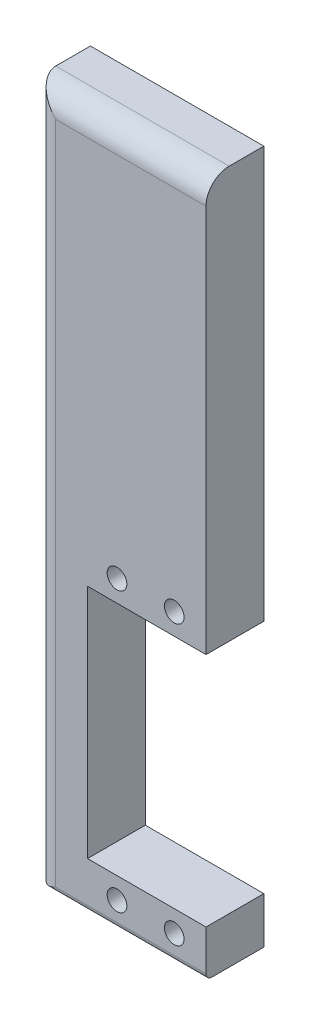
ISO-10303-21;
HEADER;
FILE_DESCRIPTION(('STEP AP214'),'2;1');
FILE_NAME('part.step','',(''),(''),'','','');
FILE_SCHEMA(('AUTOMOTIVE_DESIGN { 1 0 10303 214 1 1 1 1 }'));
ENDSEC;
DATA;
#1=APPLICATION_CONTEXT('core data for automotive mechanical design processes');
#2=APPLICATION_PROTOCOL_DEFINITION('international standard','automotive_design',2000,#1);
#3=PRODUCT_CONTEXT('',#1,'mechanical');
#4=PRODUCT('Part','Part','',(#3));
#5=PRODUCT_RELATED_PRODUCT_CATEGORY('part','',(#4));
#6=PRODUCT_DEFINITION_FORMATION('','',#4);
#7=PRODUCT_DEFINITION_CONTEXT('part definition',#1,'design');
#8=PRODUCT_DEFINITION('design','',#6,#7);
#9=PRODUCT_DEFINITION_SHAPE('','',#8);
#10=(LENGTH_UNIT() NAMED_UNIT(*) SI_UNIT(.MILLI.,.METRE.));
#11=(NAMED_UNIT(*) PLANE_ANGLE_UNIT() SI_UNIT($,.RADIAN.));
#12=(NAMED_UNIT(*) SI_UNIT($,.STERADIAN.) SOLID_ANGLE_UNIT());
#13=UNCERTAINTY_MEASURE_WITH_UNIT(LENGTH_MEASURE(1.E-05),#10,'distance_accuracy_value','');
#14=(GEOMETRIC_REPRESENTATION_CONTEXT(3) GLOBAL_UNCERTAINTY_ASSIGNED_CONTEXT((#13)) GLOBAL_UNIT_ASSIGNED_CONTEXT((#10,
#11,#12)) REPRESENTATION_CONTEXT('',''));
#15=CARTESIAN_POINT('',(0.,0.,0.));
#16=DIRECTION('',(0.,0.,1.));
#17=DIRECTION('',(1.,0.,0.));
#18=AXIS2_PLACEMENT_3D('',#15,#16,#17);
#19=CARTESIAN_POINT('',(0.,48.1900826446281,6.));
#20=DIRECTION('',(1.,0.,0.));
#21=DIRECTION('',(0.,0.,-1.));
#22=AXIS2_PLACEMENT_3D('',#19,#20,#21);
#23=CYLINDRICAL_SURFACE('',#22,4.);
#24=CARTESIAN_POINT('',(-26.9917355371901,48.1900826446281,6.));
#25=DIRECTION('',(0.707106781186547,0.707106781186547,0.));
#26=DIRECTION('',(-0.707106781186547,0.707106781186547,0.));
#27=AXIS2_PLACEMENT_3D('',#24,#25,#26);
#28=ELLIPSE('',#27,5.65685424949238,4.);
#29=CARTESIAN_POINT('',(-26.9917355371901,48.1900826446281,10.));
#30=VERTEX_POINT('',#29);
#31=CARTESIAN_POINT('',(-30.9917355371901,52.1900826446281,6.));
#32=VERTEX_POINT('',#31);
#33=EDGE_CURVE('E11',#30,#32,#28,.F.);
#34=ORIENTED_EDGE('',*,*,#33,.F.);
#35=DIRECTION('',(-1.,0.,0.));
#36=VECTOR('',#35,1.);
#37=CARTESIAN_POINT('',(0.,48.1900826446281,10.));
#38=LINE('',#37,#36);
#39=CARTESIAN_POINT('',(-0.991735537190091,48.1900826446281,10.));
#40=VERTEX_POINT('',#39);
#41=EDGE_CURVE('E193',#40,#30,#38,.T.);
#42=ORIENTED_EDGE('',*,*,#41,.F.);
#43=CARTESIAN_POINT('',(-0.991735537190091,48.1900826446281,6.));
#44=DIRECTION('',(-1.,0.,0.));
#45=DIRECTION('',(0.,-1.,0.));
#46=AXIS2_PLACEMENT_3D('',#43,#44,#45);
#47=CIRCLE('',#46,4.);
#48=CARTESIAN_POINT('',(-0.991735537190092,52.1900826446281,6.));
#49=VERTEX_POINT('',#48);
#50=EDGE_CURVE('E201',#49,#40,#47,.F.);
#51=ORIENTED_EDGE('',*,*,#50,.F.);
#52=DIRECTION('',(-1.,0.,0.));
#53=VECTOR('',#52,1.);
#54=CARTESIAN_POINT('',(0.,52.1900826446281,6.));
#55=LINE('',#54,#53);
#56=EDGE_CURVE('E197',#32,#49,#55,.F.);
#57=ORIENTED_EDGE('',*,*,#56,.F.);
#58=EDGE_LOOP('',(#34,#42,#51,#57));
#59=FACE_BOUND('',#58,.T.);
#60=ADVANCED_FACE('F45',(#59),#23,.T.);
#61=CARTESIAN_POINT('',(-26.9917355371901,0.,6.));
#62=DIRECTION('',(0.,1.,0.));
#63=DIRECTION('',(0.,0.,1.));
#64=AXIS2_PLACEMENT_3D('',#61,#62,#63);
#65=CYLINDRICAL_SURFACE('',#64,4.);
#66=DIRECTION('',(0.,-1.,0.));
#67=VECTOR('',#66,1.);
#68=CARTESIAN_POINT('',(-26.9917355371901,0.,10.));
#69=LINE('',#68,#67);
#70=CARTESIAN_POINT('',(-26.9917355371901,-66.8099173553719,10.));
#71=VERTEX_POINT('',#70);
#72=EDGE_CURVE('E189',#30,#71,#69,.T.);
#73=ORIENTED_EDGE('',*,*,#72,.F.);
#74=ORIENTED_EDGE('',*,*,#33,.T.);
#75=DIRECTION('',(0.,-1.,0.));
#76=VECTOR('',#75,1.);
#77=CARTESIAN_POINT('',(-30.9917355371901,0.,6.));
#78=LINE('',#77,#76);
#79=CARTESIAN_POINT('',(-30.9917355371901,-67.8099173553719,6.));
#80=VERTEX_POINT('',#79);
#81=EDGE_CURVE('E53',#80,#32,#78,.F.);
#82=ORIENTED_EDGE('',*,*,#81,.F.);
#83=CARTESIAN_POINT('',(-26.9917355371901,-67.8099173553719,6.));
#84=DIRECTION('',(0.,1.,0.));
#85=DIRECTION('',(0.,0.,1.));
#86=AXIS2_PLACEMENT_3D('',#83,#84,#85);
#87=CIRCLE('',#86,4.);
#88=CARTESIAN_POINT('',(-29.6374868482547,-67.8099173553719,9.));
#89=VERTEX_POINT('',#88);
#90=EDGE_CURVE('E62',#89,#80,#87,.F.);
#91=ORIENTED_EDGE('',*,*,#90,.F.);
#92=CARTESIAN_POINT('',(-26.9917355371901,-66.8099173553719,10.));
#93=CARTESIAN_POINT('',(-26.9955066191536,-66.8118028817026,9.99999999222046));
#94=CARTESIAN_POINT('',(-26.9992778607888,-66.813688502867,9.99999465955662));
#95=CARTESIAN_POINT('',(-27.2469515692103,-66.9375251819825,9.99929462497587));
#96=CARTESIAN_POINT('',(-27.4914814731329,-67.0597773598581,9.97632568529568));
#97=CARTESIAN_POINT('',(-27.8557355071508,-67.2345503346211,9.90753790551034));
#98=CARTESIAN_POINT('',(-27.9769367319579,-67.2914644009802,9.87880693999671));
#99=CARTESIAN_POINT('',(-28.2180051348492,-67.4006417664528,9.80945664704866));
#100=CARTESIAN_POINT('',(-28.3378733580448,-67.4529089725097,9.76884743214279));
#101=CARTESIAN_POINT('',(-28.5868665978255,-67.5552038152579,9.67084930682039));
#102=CARTESIAN_POINT('',(-28.715794441861,-67.6045517098129,9.61223635711574));
#103=CARTESIAN_POINT('',(-28.969334567307,-67.6907952473847,9.47985288911256));
#104=CARTESIAN_POINT('',(-29.0939666466065,-67.7277577303832,9.40616730533205));
#105=CARTESIAN_POINT('',(-29.2624349771946,-67.7664498551633,9.29349694472746));
#106=CARTESIAN_POINT('',(-29.3089031930268,-67.7758790351849,9.26097799981725));
#107=CARTESIAN_POINT('',(-29.4007405677109,-67.7915793743618,9.19373281809342));
#108=CARTESIAN_POINT('',(-29.4461103447246,-67.7978523509802,9.15900786458976));
#109=CARTESIAN_POINT('',(-29.5359599729624,-67.8067809498267,9.08711139208036));
#110=CARTESIAN_POINT('',(-29.5804276119938,-67.809402362591,9.04992011107268));
#111=CARTESIAN_POINT('',(-29.6678056059472,-67.8102945424393,8.97355726161169));
#112=CARTESIAN_POINT('',(-29.7107129949608,-67.8085574223496,8.93438222902243));
#113=CARTESIAN_POINT('',(-29.7526455176794,-67.8043228280428,8.89436972061873));
#114=B_SPLINE_CURVE_WITH_KNOTS('',3,(#92,#93,#94,#95,#96,#97,#98,#99,#100,#101,#102,#103,#104,
#105,#106,#107,#108,#109,#110,#111,#112,#113),.UNSPECIFIED.,.F.,.F.,(4,2,2,2,2,2,2,2,2,2,4),(0.,
0.0126491207600365,0.83068928016547,1.24112658481069,1.65121547632185,2.10010321574798,
2.54652790050107,2.71890420005623,2.89118112479481,3.06506140225257,3.23925655921939),.UNSPECIFIED.);
#115=EDGE_CURVE('E204',#71,#89,#114,.T.);
#116=ORIENTED_EDGE('',*,*,#115,.F.);
#117=EDGE_LOOP('',(#73,#74,#82,#91,#116));
#118=FACE_BOUND('',#117,.T.);
#119=ADVANCED_FACE('F215',(#118),#65,.T.);
#120=CARTESIAN_POINT('',(0.,-66.8099173553719,9.));
#121=DIRECTION('',(-1.,0.,0.));
#122=DIRECTION('',(0.,0.,1.));
#123=AXIS2_PLACEMENT_3D('',#120,#121,#122);
#124=CYLINDRICAL_SURFACE('',#123,1.);
#125=DIRECTION('',(1.,0.,0.));
#126=VECTOR('',#125,1.);
#127=CARTESIAN_POINT('',(0.,-66.8099173553719,10.));
#128=LINE('',#127,#126);
#129=CARTESIAN_POINT('',(-0.991735537190078,-66.8099173553719,10.));
#130=VERTEX_POINT('',#129);
#131=EDGE_CURVE('E179',#71,#130,#128,.T.);
#132=ORIENTED_EDGE('',*,*,#131,.F.);
#133=ORIENTED_EDGE('',*,*,#115,.T.);
#134=DIRECTION('',(1.,0.,0.));
#135=VECTOR('',#134,1.);
#136=CARTESIAN_POINT('',(0.,-67.8099173553719,9.));
#137=LINE('',#136,#135);
#138=CARTESIAN_POINT('',(-0.991735537190078,-67.8099173553719,9.));
#139=VERTEX_POINT('',#138);
#140=EDGE_CURVE('E182',#139,#89,#137,.F.);
#141=ORIENTED_EDGE('',*,*,#140,.F.);
#142=CARTESIAN_POINT('',(-0.991735537190078,-66.8099173553719,9.));
#143=DIRECTION('',(-1.,0.,0.));
#144=DIRECTION('',(0.,-1.,0.));
#145=AXIS2_PLACEMENT_3D('',#142,#143,#144);
#146=CIRCLE('',#145,1.);
#147=EDGE_CURVE('E186',#130,#139,#146,.F.);
#148=ORIENTED_EDGE('',*,*,#147,.F.);
#149=EDGE_LOOP('',(#132,#133,#141,#148));
#150=FACE_BOUND('',#149,.T.);
#151=ADVANCED_FACE('F212',(#150),#124,.T.);
#152=CARTESIAN_POINT('',(-0.991735537190092,52.1900826446281,10.));
#153=DIRECTION('',(-1.,0.,0.));
#154=DIRECTION('',(0.,-1.,0.));
#155=AXIS2_PLACEMENT_3D('',#152,#153,#154);
#156=PLANE('',#155);
#157=DIRECTION('',(0.,1.,0.));
#158=VECTOR('',#157,1.);
#159=CARTESIAN_POINT('',(-0.991735537190092,52.1900826446281,10.));
#160=LINE('',#159,#158);
#161=CARTESIAN_POINT('',(-0.991735537190078,-59.7862092815298,10.));
#162=VERTEX_POINT('',#161);
#163=EDGE_CURVE('E170',#130,#162,#160,.T.);
#164=ORIENTED_EDGE('',*,*,#163,.F.);
#165=ORIENTED_EDGE('',*,*,#147,.T.);
#166=DIRECTION('',(0.,0.,-1.));
#167=VECTOR('',#166,1.);
#168=CARTESIAN_POINT('',(-0.991735537190078,-67.8099173553719,10.));
#169=LINE('',#168,#167);
#170=CARTESIAN_POINT('',(-0.991735537190078,-67.8099173553719,0.));
#171=VERTEX_POINT('',#170);
#172=EDGE_CURVE('E173',#139,#171,#169,.T.);
#173=ORIENTED_EDGE('',*,*,#172,.T.);
#174=DIRECTION('',(0.,1.,0.));
#175=VECTOR('',#174,1.);
#176=CARTESIAN_POINT('',(-0.991735537190092,52.1900826446281,0.));
#177=LINE('',#176,#175);
#178=CARTESIAN_POINT('',(-0.991735537190078,-59.7862092815298,0.));
#179=VERTEX_POINT('',#178);
#180=EDGE_CURVE('E153',#171,#179,#177,.T.);
#181=ORIENTED_EDGE('',*,*,#180,.T.);
#182=DIRECTION('',(0.,0.,-1.));
#183=VECTOR('',#182,1.);
#184=CARTESIAN_POINT('',(-0.991735537190078,-59.7862092815298,10.));
#185=LINE('',#184,#183);
#186=EDGE_CURVE('E145',#162,#179,#185,.T.);
#187=ORIENTED_EDGE('',*,*,#186,.F.);
#188=EDGE_LOOP('',(#164,#165,#173,#181,#187));
#189=FACE_BOUND('',#188,.T.);
#190=ADVANCED_FACE('F222',(#189),#156,.F.);
#191=CARTESIAN_POINT('',(0.,0.,10.));
#192=DIRECTION('',(0.,0.,1.));
#193=DIRECTION('',(1.,0.,0.));
#194=AXIS2_PLACEMENT_3D('',#191,#192,#193);
#195=PLANE('',#194);
#196=CARTESIAN_POINT('',(-16.3917355371901,-63.4862092815298,10.));
#197=DIRECTION('',(0.,0.,1.));
#198=DIRECTION('',(1.,0.,0.));
#199=AXIS2_PLACEMENT_3D('',#196,#197,#198);
#200=CIRCLE('',#199,1.70000000000001);
#201=CARTESIAN_POINT('',(-14.6917355371901,-63.4862092815298,10.));
#202=VERTEX_POINT('',#201);
#203=EDGE_CURVE('E267',#202,#202,#200,.T.);
#204=ORIENTED_EDGE('',*,*,#203,.F.);
#205=EDGE_LOOP('',(#204));
#206=FACE_BOUND('',#205,.T.);
#207=CARTESIAN_POINT('',(-16.3917355371901,-15.2862092815298,10.));
#208=DIRECTION('',(0.,0.,-1.));
#209=DIRECTION('',(-1.,0.,0.));
#210=AXIS2_PLACEMENT_3D('',#207,#208,#209);
#211=CIRCLE('',#210,1.7);
#212=CARTESIAN_POINT('',(-18.0917355371901,-15.2862092815298,10.));
#213=VERTEX_POINT('',#212);
#214=EDGE_CURVE('E274',#213,#213,#211,.T.);
#215=ORIENTED_EDGE('',*,*,#214,.T.);
#216=EDGE_LOOP('',(#215));
#217=FACE_BOUND('',#216,.T.);
#218=CARTESIAN_POINT('',(-6.49173553719008,-63.4862092815298,10.));
#219=DIRECTION('',(0.,0.,1.));
#220=DIRECTION('',(1.,0.,0.));
#221=AXIS2_PLACEMENT_3D('',#218,#219,#220);
#222=CIRCLE('',#221,1.70000000000001);
#223=CARTESIAN_POINT('',(-4.79173553719007,-63.4862092815298,10.));
#224=VERTEX_POINT('',#223);
#225=EDGE_CURVE('E247',#224,#224,#222,.T.);
#226=ORIENTED_EDGE('',*,*,#225,.F.);
#227=EDGE_LOOP('',(#226));
#228=FACE_BOUND('',#227,.T.);
#229=CARTESIAN_POINT('',(-0.991735537190078,-18.9862092815298,10.));
#230=VERTEX_POINT('',#229);
#231=EDGE_CURVE('E143',#230,#40,#160,.T.);
#232=ORIENTED_EDGE('',*,*,#231,.T.);
#233=ORIENTED_EDGE('',*,*,#41,.T.);
#234=ORIENTED_EDGE('',*,*,#72,.T.);
#235=ORIENTED_EDGE('',*,*,#131,.T.);
#236=ORIENTED_EDGE('',*,*,#163,.T.);
#237=DIRECTION('',(-1.,0.,0.));
#238=VECTOR('',#237,1.);
#239=CARTESIAN_POINT('',(-0.991735537190078,-59.7862092815298,10.));
#240=LINE('',#239,#238);
#241=CARTESIAN_POINT('',(-21.4917355371901,-59.7862092815298,10.));
#242=VERTEX_POINT('',#241);
#243=EDGE_CURVE('E285',#162,#242,#240,.T.);
#244=ORIENTED_EDGE('',*,*,#243,.T.);
#245=DIRECTION('',(0.,-1.,0.));
#246=VECTOR('',#245,1.);
#247=CARTESIAN_POINT('',(-21.4917355371901,-18.9862092815298,10.));
#248=LINE('',#247,#246);
#249=CARTESIAN_POINT('',(-21.4917355371901,-18.9862092815298,10.));
#250=VERTEX_POINT('',#249);
#251=EDGE_CURVE('E133',#250,#242,#248,.T.);
#252=ORIENTED_EDGE('',*,*,#251,.F.);
#253=DIRECTION('',(1.,0.,0.));
#254=VECTOR('',#253,1.);
#255=CARTESIAN_POINT('',(-21.4917355371901,-18.9862092815298,10.));
#256=LINE('',#255,#254);
#257=EDGE_CURVE('E288',#250,#230,#256,.T.);
#258=ORIENTED_EDGE('',*,*,#257,.T.);
#259=EDGE_LOOP('',(#232,#233,#234,#235,#236,#244,#252,#258));
#260=FACE_BOUND('',#259,.T.);
#261=CARTESIAN_POINT('',(-6.49173553719008,-15.2862092815298,10.));
#262=DIRECTION('',(0.,0.,-1.));
#263=DIRECTION('',(-1.,0.,0.));
#264=AXIS2_PLACEMENT_3D('',#261,#262,#263);
#265=CIRCLE('',#264,1.7);
#266=CARTESIAN_POINT('',(-8.19173553719008,-15.2862092815298,10.));
#267=VERTEX_POINT('',#266);
#268=EDGE_CURVE('E258',#267,#267,#265,.T.);
#269=ORIENTED_EDGE('',*,*,#268,.T.);
#270=EDGE_LOOP('',(#269));
#271=FACE_BOUND('',#270,.T.);
#272=ADVANCED_FACE('F228',(#206,#217,#228,#260,#271),#195,.T.);
#273=CARTESIAN_POINT('',(0.,0.,0.));
#274=DIRECTION('',(0.,0.,1.));
#275=DIRECTION('',(1.,0.,0.));
#276=AXIS2_PLACEMENT_3D('',#273,#274,#275);
#277=PLANE('',#276);
#278=CARTESIAN_POINT('',(-16.3917355371901,-63.4862092815298,0.));
#279=DIRECTION('',(0.,0.,1.));
#280=DIRECTION('',(1.,0.,0.));
#281=AXIS2_PLACEMENT_3D('',#278,#279,#280);
#282=CIRCLE('',#281,1.70000000000001);
#283=CARTESIAN_POINT('',(-14.6917355371901,-63.4862092815298,0.));
#284=VERTEX_POINT('',#283);
#285=EDGE_CURVE('E256',#284,#284,#282,.T.);
#286=ORIENTED_EDGE('',*,*,#285,.T.);
#287=EDGE_LOOP('',(#286));
#288=FACE_BOUND('',#287,.T.);
#289=DIRECTION('',(0.,-1.,0.));
#290=VECTOR('',#289,1.);
#291=CARTESIAN_POINT('',(-21.4917355371901,-18.9862092815298,0.));
#292=LINE('',#291,#290);
#293=CARTESIAN_POINT('',(-21.4917355371901,-18.9862092815298,0.));
#294=VERTEX_POINT('',#293);
#295=CARTESIAN_POINT('',(-21.4917355371901,-59.7862092815298,0.));
#296=VERTEX_POINT('',#295);
#297=EDGE_CURVE('E263',#294,#296,#292,.T.);
#298=ORIENTED_EDGE('',*,*,#297,.T.);
#299=DIRECTION('',(-1.,0.,0.));
#300=VECTOR('',#299,1.);
#301=CARTESIAN_POINT('',(-0.991735537190078,-59.7862092815298,0.));
#302=LINE('',#301,#300);
#303=EDGE_CURVE('E132',#179,#296,#302,.T.);
#304=ORIENTED_EDGE('',*,*,#303,.F.);
#305=ORIENTED_EDGE('',*,*,#180,.F.);
#306=DIRECTION('',(1.,0.,0.));
#307=VECTOR('',#306,1.);
#308=CARTESIAN_POINT('',(-30.9917355371901,-67.8099173553719,0.));
#309=LINE('',#308,#307);
#310=CARTESIAN_POINT('',(-30.9917355371901,-67.8099173553719,0.));
#311=VERTEX_POINT('',#310);
#312=EDGE_CURVE('E154',#311,#171,#309,.T.);
#313=ORIENTED_EDGE('',*,*,#312,.F.);
#314=DIRECTION('',(0.,-1.,0.));
#315=VECTOR('',#314,1.);
#316=CARTESIAN_POINT('',(-30.9917355371901,52.1900826446281,0.));
#317=LINE('',#316,#315);
#318=CARTESIAN_POINT('',(-30.9917355371901,52.1900826446281,0.));
#319=VERTEX_POINT('',#318);
#320=EDGE_CURVE('E160',#319,#311,#317,.T.);
#321=ORIENTED_EDGE('',*,*,#320,.F.);
#322=DIRECTION('',(-1.,0.,0.));
#323=VECTOR('',#322,1.);
#324=CARTESIAN_POINT('',(-30.9917355371901,52.1900826446281,0.));
#325=LINE('',#324,#323);
#326=CARTESIAN_POINT('',(-0.991735537190092,52.1900826446281,0.));
#327=VERTEX_POINT('',#326);
#328=EDGE_CURVE('E151',#327,#319,#325,.T.);
#329=ORIENTED_EDGE('',*,*,#328,.F.);
#330=CARTESIAN_POINT('',(-0.991735537190078,-18.9862092815298,0.));
#331=VERTEX_POINT('',#330);
#332=EDGE_CURVE('E140',#331,#327,#177,.T.);
#333=ORIENTED_EDGE('',*,*,#332,.F.);
#334=DIRECTION('',(1.,0.,0.));
#335=VECTOR('',#334,1.);
#336=CARTESIAN_POINT('',(-21.4917355371901,-18.9862092815298,0.));
#337=LINE('',#336,#335);
#338=EDGE_CURVE('E121',#294,#331,#337,.T.);
#339=ORIENTED_EDGE('',*,*,#338,.F.);
#340=EDGE_LOOP('',(#298,#304,#305,#313,#321,#329,#333,#339));
#341=FACE_BOUND('',#340,.T.);
#342=CARTESIAN_POINT('',(-16.3917355371901,-15.2862092815298,0.));
#343=DIRECTION('',(0.,0.,-1.));
#344=DIRECTION('',(-1.,0.,0.));
#345=AXIS2_PLACEMENT_3D('',#342,#343,#344);
#346=CIRCLE('',#345,1.7);
#347=CARTESIAN_POINT('',(-18.0917355371901,-15.2862092815298,0.));
#348=VERTEX_POINT('',#347);
#349=EDGE_CURVE('E278',#348,#348,#346,.T.);
#350=ORIENTED_EDGE('',*,*,#349,.F.);
#351=EDGE_LOOP('',(#350));
#352=FACE_BOUND('',#351,.T.);
#353=CARTESIAN_POINT('',(-6.49173553719008,-63.4862092815298,0.));
#354=DIRECTION('',(0.,0.,1.));
#355=DIRECTION('',(1.,0.,0.));
#356=AXIS2_PLACEMENT_3D('',#353,#354,#355);
#357=CIRCLE('',#356,1.70000000000001);
#358=CARTESIAN_POINT('',(-4.79173553719007,-63.4862092815298,0.));
#359=VERTEX_POINT('',#358);
#360=EDGE_CURVE('E243',#359,#359,#357,.T.);
#361=ORIENTED_EDGE('',*,*,#360,.T.);
#362=EDGE_LOOP('',(#361));
#363=FACE_BOUND('',#362,.T.);
#364=CARTESIAN_POINT('',(-6.49173553719008,-15.2862092815298,0.));
#365=DIRECTION('',(0.,0.,-1.));
#366=DIRECTION('',(-1.,0.,0.));
#367=AXIS2_PLACEMENT_3D('',#364,#365,#366);
#368=CIRCLE('',#367,1.7);
#369=CARTESIAN_POINT('',(-8.19173553719008,-15.2862092815298,0.));
#370=VERTEX_POINT('',#369);
#371=EDGE_CURVE('E262',#370,#370,#368,.T.);
#372=ORIENTED_EDGE('',*,*,#371,.F.);
#373=EDGE_LOOP('',(#372));
#374=FACE_BOUND('',#373,.T.);
#375=ADVANCED_FACE('F147',(#288,#341,#352,#363,#374),#277,.F.);
#376=CARTESIAN_POINT('',(-30.9917355371901,52.1900826446281,10.));
#377=DIRECTION('',(1.,0.,0.));
#378=DIRECTION('',(0.,0.,-1.));
#379=AXIS2_PLACEMENT_3D('',#376,#377,#378);
#380=PLANE('',#379);
#381=DIRECTION('',(0.,0.,-1.));
#382=VECTOR('',#381,1.);
#383=CARTESIAN_POINT('',(-30.9917355371901,-67.8099173553719,10.));
#384=LINE('',#383,#382);
#385=EDGE_CURVE('E176',#80,#311,#384,.T.);
#386=ORIENTED_EDGE('',*,*,#385,.F.);
#387=ORIENTED_EDGE('',*,*,#81,.T.);
#388=DIRECTION('',(0.,0.,-1.));
#389=VECTOR('',#388,1.);
#390=CARTESIAN_POINT('',(-30.9917355371901,52.1900826446281,10.));
#391=LINE('',#390,#389);
#392=EDGE_CURVE('E166',#32,#319,#391,.T.);
#393=ORIENTED_EDGE('',*,*,#392,.T.);
#394=ORIENTED_EDGE('',*,*,#320,.T.);
#395=EDGE_LOOP('',(#386,#387,#393,#394));
#396=FACE_BOUND('',#395,.T.);
#397=ADVANCED_FACE('F312',(#396),#380,.F.);
#398=CARTESIAN_POINT('',(-30.9917355371901,-67.8099173553719,10.));
#399=DIRECTION('',(0.,1.,0.));
#400=DIRECTION('',(0.,0.,1.));
#401=AXIS2_PLACEMENT_3D('',#398,#399,#400);
#402=PLANE('',#401);
#403=ORIENTED_EDGE('',*,*,#140,.T.);
#404=ORIENTED_EDGE('',*,*,#90,.T.);
#405=ORIENTED_EDGE('',*,*,#385,.T.);
#406=ORIENTED_EDGE('',*,*,#312,.T.);
#407=ORIENTED_EDGE('',*,*,#172,.F.);
#408=EDGE_LOOP('',(#403,#404,#405,#406,#407));
#409=FACE_BOUND('',#408,.T.);
#410=ADVANCED_FACE('F311',(#409),#402,.F.);
#411=DIRECTION('',(0.,0.,-1.));
#412=VECTOR('',#411,1.);
#413=CARTESIAN_POINT('',(-0.991735537190092,52.1900826446281,10.));
#414=LINE('',#413,#412);
#415=EDGE_CURVE('E169',#49,#327,#414,.T.);
#416=ORIENTED_EDGE('',*,*,#415,.F.);
#417=ORIENTED_EDGE('',*,*,#50,.T.);
#418=ORIENTED_EDGE('',*,*,#231,.F.);
#419=DIRECTION('',(0.,0.,-1.));
#420=VECTOR('',#419,1.);
#421=CARTESIAN_POINT('',(-0.991735537190078,-18.9862092815298,10.));
#422=LINE('',#421,#420);
#423=EDGE_CURVE('E125',#230,#331,#422,.T.);
#424=ORIENTED_EDGE('',*,*,#423,.T.);
#425=ORIENTED_EDGE('',*,*,#332,.T.);
#426=EDGE_LOOP('',(#416,#417,#418,#424,#425));
#427=FACE_BOUND('',#426,.T.);
#428=ADVANCED_FACE('F139',(#427),#156,.F.);
#429=CARTESIAN_POINT('',(-30.9917355371901,52.1900826446281,10.));
#430=DIRECTION('',(0.,-1.,0.));
#431=DIRECTION('',(0.,0.,-1.));
#432=AXIS2_PLACEMENT_3D('',#429,#430,#431);
#433=PLANE('',#432);
#434=ORIENTED_EDGE('',*,*,#392,.F.);
#435=ORIENTED_EDGE('',*,*,#56,.T.);
#436=ORIENTED_EDGE('',*,*,#415,.T.);
#437=ORIENTED_EDGE('',*,*,#328,.T.);
#438=EDGE_LOOP('',(#434,#435,#436,#437));
#439=FACE_BOUND('',#438,.T.);
#440=ADVANCED_FACE('F317',(#439),#433,.F.);
#441=CARTESIAN_POINT('',(-6.49173553719008,-63.4862092815298,10.));
#442=DIRECTION('',(0.,0.,-1.));
#443=DIRECTION('',(-1.,0.,0.));
#444=AXIS2_PLACEMENT_3D('',#441,#442,#443);
#445=CYLINDRICAL_SURFACE('',#444,1.70000000000001);
#446=ORIENTED_EDGE('',*,*,#225,.T.);
#447=EDGE_LOOP('',(#446));
#448=FACE_BOUND('',#447,.T.);
#449=ORIENTED_EDGE('',*,*,#360,.F.);
#450=EDGE_LOOP('',(#449));
#451=FACE_BOUND('',#450,.T.);
#452=ADVANCED_FACE('F319',(#448,#451),#445,.F.);
#453=CARTESIAN_POINT('',(-16.3917355371901,-15.2862092815298,10.));
#454=DIRECTION('',(0.,0.,-1.));
#455=DIRECTION('',(-1.,0.,0.));
#456=AXIS2_PLACEMENT_3D('',#453,#454,#455);
#457=CYLINDRICAL_SURFACE('',#456,1.7);
#458=ORIENTED_EDGE('',*,*,#214,.F.);
#459=EDGE_LOOP('',(#458));
#460=FACE_BOUND('',#459,.T.);
#461=ORIENTED_EDGE('',*,*,#349,.T.);
#462=EDGE_LOOP('',(#461));
#463=FACE_BOUND('',#462,.T.);
#464=ADVANCED_FACE('F325',(#460,#463),#457,.F.);
#465=CARTESIAN_POINT('',(-21.4917355371901,-18.9862092815298,10.));
#466=DIRECTION('',(1.,0.,0.));
#467=DIRECTION('',(0.,0.,-1.));
#468=AXIS2_PLACEMENT_3D('',#465,#466,#467);
#469=PLANE('',#468);
#470=ORIENTED_EDGE('',*,*,#297,.F.);
#471=DIRECTION('',(0.,0.,-1.));
#472=VECTOR('',#471,1.);
#473=CARTESIAN_POINT('',(-21.4917355371901,-18.9862092815298,10.));
#474=LINE('',#473,#472);
#475=EDGE_CURVE('E127',#250,#294,#474,.T.);
#476=ORIENTED_EDGE('',*,*,#475,.F.);
#477=ORIENTED_EDGE('',*,*,#251,.T.);
#478=DIRECTION('',(0.,0.,-1.));
#479=VECTOR('',#478,1.);
#480=CARTESIAN_POINT('',(-21.4917355371901,-59.7862092815298,10.));
#481=LINE('',#480,#479);
#482=EDGE_CURVE('E282',#242,#296,#481,.T.);
#483=ORIENTED_EDGE('',*,*,#482,.T.);
#484=EDGE_LOOP('',(#470,#476,#477,#483));
#485=FACE_BOUND('',#484,.T.);
#486=ADVANCED_FACE('F303',(#485),#469,.T.);
#487=CARTESIAN_POINT('',(-0.991735537190078,-59.7862092815298,10.));
#488=DIRECTION('',(0.,-1.,0.));
#489=DIRECTION('',(0.,0.,-1.));
#490=AXIS2_PLACEMENT_3D('',#487,#488,#489);
#491=PLANE('',#490);
#492=ORIENTED_EDGE('',*,*,#303,.T.);
#493=ORIENTED_EDGE('',*,*,#482,.F.);
#494=ORIENTED_EDGE('',*,*,#243,.F.);
#495=ORIENTED_EDGE('',*,*,#186,.T.);
#496=EDGE_LOOP('',(#492,#493,#494,#495));
#497=FACE_BOUND('',#496,.T.);
#498=ADVANCED_FACE('F307',(#497),#491,.F.);
#499=CARTESIAN_POINT('',(-21.4917355371901,-18.9862092815298,10.));
#500=DIRECTION('',(0.,1.,0.));
#501=DIRECTION('',(-1.,0.,0.));
#502=AXIS2_PLACEMENT_3D('',#499,#500,#501);
#503=PLANE('',#502);
#504=ORIENTED_EDGE('',*,*,#338,.T.);
#505=ORIENTED_EDGE('',*,*,#423,.F.);
#506=ORIENTED_EDGE('',*,*,#257,.F.);
#507=ORIENTED_EDGE('',*,*,#475,.T.);
#508=EDGE_LOOP('',(#504,#505,#506,#507));
#509=FACE_BOUND('',#508,.T.);
#510=ADVANCED_FACE('F123',(#509),#503,.F.);
#511=CARTESIAN_POINT('',(-6.49173553719008,-15.2862092815298,10.));
#512=DIRECTION('',(0.,0.,-1.));
#513=DIRECTION('',(-1.,0.,0.));
#514=AXIS2_PLACEMENT_3D('',#511,#512,#513);
#515=CYLINDRICAL_SURFACE('',#514,1.7);
#516=ORIENTED_EDGE('',*,*,#268,.F.);
#517=EDGE_LOOP('',(#516));
#518=FACE_BOUND('',#517,.T.);
#519=ORIENTED_EDGE('',*,*,#371,.T.);
#520=EDGE_LOOP('',(#519));
#521=FACE_BOUND('',#520,.T.);
#522=ADVANCED_FACE('F345',(#518,#521),#515,.F.);
#523=CARTESIAN_POINT('',(-16.3917355371901,-63.4862092815298,10.));
#524=DIRECTION('',(0.,0.,-1.));
#525=DIRECTION('',(-1.,0.,0.));
#526=AXIS2_PLACEMENT_3D('',#523,#524,#525);
#527=CYLINDRICAL_SURFACE('',#526,1.70000000000001);
#528=ORIENTED_EDGE('',*,*,#203,.T.);
#529=EDGE_LOOP('',(#528));
#530=FACE_BOUND('',#529,.T.);
#531=ORIENTED_EDGE('',*,*,#285,.F.);
#532=EDGE_LOOP('',(#531));
#533=FACE_BOUND('',#532,.T.);
#534=ADVANCED_FACE('F343',(#530,#533),#527,.F.);
#535=CLOSED_SHELL('',(#60,#119,#151,#190,#272,#375,#397,#410,#428,#440,#452,#464,#486,#498,#510,
#522,#534));
#536=MANIFOLD_SOLID_BREP('B2',#535);
#537=ADVANCED_BREP_SHAPE_REPRESENTATION('',(#18,#536),#14);
#538=SHAPE_DEFINITION_REPRESENTATION(#9,#537);
ENDSEC;
END-ISO-10303-21;
